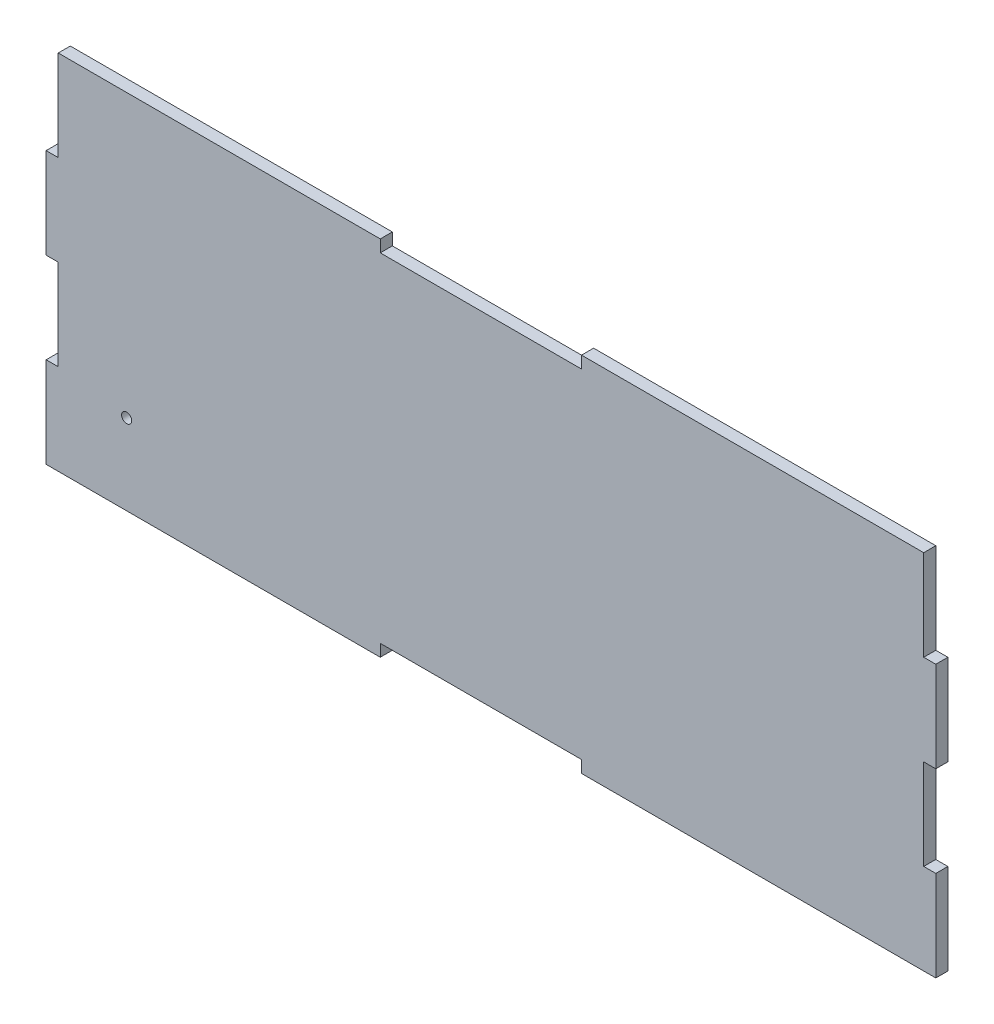
ISO-10303-21;
HEADER;
FILE_DESCRIPTION(('STEP AP214'),'2;1');
FILE_NAME('part.step','',(''),(''),'','','');
FILE_SCHEMA(('AUTOMOTIVE_DESIGN { 1 0 10303 214 1 1 1 1 }'));
ENDSEC;
DATA;
#1=APPLICATION_CONTEXT('core data for automotive mechanical design processes');
#2=APPLICATION_PROTOCOL_DEFINITION('international standard','automotive_design',2000,#1);
#3=PRODUCT_CONTEXT('',#1,'mechanical');
#4=PRODUCT('Part','Part','',(#3));
#5=PRODUCT_RELATED_PRODUCT_CATEGORY('part','',(#4));
#6=PRODUCT_DEFINITION_FORMATION('','',#4);
#7=PRODUCT_DEFINITION_CONTEXT('part definition',#1,'design');
#8=PRODUCT_DEFINITION('design','',#6,#7);
#9=PRODUCT_DEFINITION_SHAPE('','',#8);
#10=(LENGTH_UNIT() NAMED_UNIT(*) SI_UNIT(.MILLI.,.METRE.));
#11=(NAMED_UNIT(*) PLANE_ANGLE_UNIT() SI_UNIT($,.RADIAN.));
#12=(NAMED_UNIT(*) SI_UNIT($,.STERADIAN.) SOLID_ANGLE_UNIT());
#13=UNCERTAINTY_MEASURE_WITH_UNIT(LENGTH_MEASURE(1.E-05),#10,'distance_accuracy_value','');
#14=(GEOMETRIC_REPRESENTATION_CONTEXT(3) GLOBAL_UNCERTAINTY_ASSIGNED_CONTEXT((#13)) GLOBAL_UNIT_ASSIGNED_CONTEXT((#10,
#11,#12)) REPRESENTATION_CONTEXT('',''));
#15=CARTESIAN_POINT('',(0.,0.,0.));
#16=DIRECTION('',(0.,0.,1.));
#17=DIRECTION('',(1.,0.,0.));
#18=AXIS2_PLACEMENT_3D('',#15,#16,#17);
#19=CARTESIAN_POINT('',(0.,0.,3.));
#20=DIRECTION('',(0.,0.,-1.));
#21=DIRECTION('',(-1.,0.,0.));
#22=AXIS2_PLACEMENT_3D('',#19,#20,#21);
#23=PLANE('',#22);
#24=DIRECTION('',(1.,0.,0.));
#25=VECTOR('',#24,1.);
#26=CARTESIAN_POINT('',(-2.00000000000049,-43.,3.));
#27=LINE('',#26,#25);
#28=CARTESIAN_POINT('',(-5.00000000000049,-43.,3.));
#29=VERTEX_POINT('',#28);
#30=CARTESIAN_POINT('',(77.9999999999995,-43.,3.));
#31=VERTEX_POINT('',#30);
#32=EDGE_CURVE('E140',#29,#31,#27,.T.);
#33=ORIENTED_EDGE('',*,*,#32,.T.);
#34=DIRECTION('',(0.,1.,0.));
#35=VECTOR('',#34,1.);
#36=CARTESIAN_POINT('',(77.9999999999995,-43.,3.));
#37=LINE('',#36,#35);
#38=CARTESIAN_POINT('',(77.9999999999995,-40.,3.));
#39=VERTEX_POINT('',#38);
#40=EDGE_CURVE('E401',#31,#39,#37,.T.);
#41=ORIENTED_EDGE('',*,*,#40,.T.);
#42=DIRECTION('',(1.,0.,0.));
#43=VECTOR('',#42,1.);
#44=CARTESIAN_POINT('',(77.9999999999995,-40.,3.));
#45=LINE('',#44,#43);
#46=CARTESIAN_POINT('',(127.999999999999,-40.,3.));
#47=VERTEX_POINT('',#46);
#48=EDGE_CURVE('E337',#39,#47,#45,.T.);
#49=ORIENTED_EDGE('',*,*,#48,.T.);
#50=DIRECTION('',(0.,-1.,0.));
#51=VECTOR('',#50,1.);
#52=CARTESIAN_POINT('',(127.999999999999,-43.,3.));
#53=LINE('',#52,#51);
#54=CARTESIAN_POINT('',(127.999999999999,-43.,3.));
#55=VERTEX_POINT('',#54);
#56=EDGE_CURVE('E355',#47,#55,#53,.T.);
#57=ORIENTED_EDGE('',*,*,#56,.T.);
#58=DIRECTION('',(1.,0.,0.));
#59=VECTOR('',#58,1.);
#60=CARTESIAN_POINT('',(127.999999999999,-43.,3.));
#61=LINE('',#60,#59);
#62=CARTESIAN_POINT('',(215.999999999999,-43.,3.));
#63=VERTEX_POINT('',#62);
#64=EDGE_CURVE('E352',#55,#63,#61,.T.);
#65=ORIENTED_EDGE('',*,*,#64,.T.);
#66=DIRECTION('',(0.,1.,0.));
#67=VECTOR('',#66,1.);
#68=CARTESIAN_POINT('',(215.999999999999,-43.,3.));
#69=LINE('',#68,#67);
#70=CARTESIAN_POINT('',(215.999999999999,-20.5,3.));
#71=VERTEX_POINT('',#70);
#72=EDGE_CURVE('E354',#63,#71,#69,.T.);
#73=ORIENTED_EDGE('',*,*,#72,.T.);
#74=DIRECTION('',(-1.,0.,0.));
#75=VECTOR('',#74,1.);
#76=CARTESIAN_POINT('',(212.999999999999,-20.5,3.));
#77=LINE('',#76,#75);
#78=CARTESIAN_POINT('',(212.999999999999,-20.5,3.));
#79=VERTEX_POINT('',#78);
#80=EDGE_CURVE('E357',#71,#79,#77,.T.);
#81=ORIENTED_EDGE('',*,*,#80,.T.);
#82=DIRECTION('',(0.,1.,0.));
#83=VECTOR('',#82,1.);
#84=CARTESIAN_POINT('',(212.999999999999,-20.5,3.));
#85=LINE('',#84,#83);
#86=CARTESIAN_POINT('',(212.999999999999,2.,3.));
#87=VERTEX_POINT('',#86);
#88=EDGE_CURVE('E363',#79,#87,#85,.T.);
#89=ORIENTED_EDGE('',*,*,#88,.T.);
#90=DIRECTION('',(1.,0.,0.));
#91=VECTOR('',#90,1.);
#92=CARTESIAN_POINT('',(212.999999999999,2.,3.));
#93=LINE('',#92,#91);
#94=CARTESIAN_POINT('',(215.999999999999,2.,3.));
#95=VERTEX_POINT('',#94);
#96=EDGE_CURVE('E365',#87,#95,#93,.T.);
#97=ORIENTED_EDGE('',*,*,#96,.T.);
#98=DIRECTION('',(0.,1.,0.));
#99=VECTOR('',#98,1.);
#100=CARTESIAN_POINT('',(215.999999999999,24.5,3.));
#101=LINE('',#100,#99);
#102=CARTESIAN_POINT('',(215.999999999999,24.5,3.));
#103=VERTEX_POINT('',#102);
#104=EDGE_CURVE('E367',#95,#103,#101,.T.);
#105=ORIENTED_EDGE('',*,*,#104,.T.);
#106=DIRECTION('',(-1.,0.,0.));
#107=VECTOR('',#106,1.);
#108=CARTESIAN_POINT('',(212.999999999999,24.5,3.));
#109=LINE('',#108,#107);
#110=CARTESIAN_POINT('',(212.999999999999,24.5,3.));
#111=VERTEX_POINT('',#110);
#112=EDGE_CURVE('E369',#103,#111,#109,.T.);
#113=ORIENTED_EDGE('',*,*,#112,.T.);
#114=DIRECTION('',(0.,1.,0.));
#115=VECTOR('',#114,1.);
#116=CARTESIAN_POINT('',(212.999999999999,24.5,3.));
#117=LINE('',#116,#115);
#118=CARTESIAN_POINT('',(212.999999999999,47.,3.));
#119=VERTEX_POINT('',#118);
#120=EDGE_CURVE('E371',#111,#119,#117,.T.);
#121=ORIENTED_EDGE('',*,*,#120,.T.);
#122=DIRECTION('',(-1.,0.,0.));
#123=VECTOR('',#122,1.);
#124=CARTESIAN_POINT('',(128.,47.,3.));
#125=LINE('',#124,#123);
#126=CARTESIAN_POINT('',(128.,47.,3.));
#127=VERTEX_POINT('',#126);
#128=EDGE_CURVE('E373',#119,#127,#125,.T.);
#129=ORIENTED_EDGE('',*,*,#128,.T.);
#130=DIRECTION('',(0.,-1.,0.));
#131=VECTOR('',#130,1.);
#132=CARTESIAN_POINT('',(128.,47.,3.));
#133=LINE('',#132,#131);
#134=CARTESIAN_POINT('',(128.,44.,3.));
#135=VERTEX_POINT('',#134);
#136=EDGE_CURVE('E375',#127,#135,#133,.T.);
#137=ORIENTED_EDGE('',*,*,#136,.T.);
#138=DIRECTION('',(-1.,0.,0.));
#139=VECTOR('',#138,1.);
#140=CARTESIAN_POINT('',(77.9999999999995,44.,3.));
#141=LINE('',#140,#139);
#142=CARTESIAN_POINT('',(77.9999999999995,44.,3.));
#143=VERTEX_POINT('',#142);
#144=EDGE_CURVE('E377',#135,#143,#141,.T.);
#145=ORIENTED_EDGE('',*,*,#144,.T.);
#146=DIRECTION('',(0.,1.,0.));
#147=VECTOR('',#146,1.);
#148=CARTESIAN_POINT('',(77.9999999999995,47.,3.));
#149=LINE('',#148,#147);
#150=CARTESIAN_POINT('',(77.9999999999995,47.,3.));
#151=VERTEX_POINT('',#150);
#152=EDGE_CURVE('E379',#143,#151,#149,.T.);
#153=ORIENTED_EDGE('',*,*,#152,.T.);
#154=DIRECTION('',(-1.,0.,0.));
#155=VECTOR('',#154,1.);
#156=CARTESIAN_POINT('',(-2.00000000000051,47.,3.));
#157=LINE('',#156,#155);
#158=CARTESIAN_POINT('',(-2.00000000000051,47.,3.));
#159=VERTEX_POINT('',#158);
#160=EDGE_CURVE('E381',#151,#159,#157,.T.);
#161=ORIENTED_EDGE('',*,*,#160,.T.);
#162=DIRECTION('',(0.,-1.,0.));
#163=VECTOR('',#162,1.);
#164=CARTESIAN_POINT('',(-2.0000000000005,24.5,3.));
#165=LINE('',#164,#163);
#166=CARTESIAN_POINT('',(-2.0000000000005,24.5,3.));
#167=VERTEX_POINT('',#166);
#168=EDGE_CURVE('E383',#159,#167,#165,.T.);
#169=ORIENTED_EDGE('',*,*,#168,.T.);
#170=DIRECTION('',(-1.,0.,0.));
#171=VECTOR('',#170,1.);
#172=CARTESIAN_POINT('',(-2.0000000000005,24.5,3.));
#173=LINE('',#172,#171);
#174=CARTESIAN_POINT('',(-5.0000000000005,24.5,3.));
#175=VERTEX_POINT('',#174);
#176=EDGE_CURVE('E385',#167,#175,#173,.T.);
#177=ORIENTED_EDGE('',*,*,#176,.T.);
#178=DIRECTION('',(0.,-1.,0.));
#179=VECTOR('',#178,1.);
#180=CARTESIAN_POINT('',(-5.0000000000005,24.5,3.));
#181=LINE('',#180,#179);
#182=CARTESIAN_POINT('',(-5.0000000000005,2.,3.));
#183=VERTEX_POINT('',#182);
#184=EDGE_CURVE('E387',#175,#183,#181,.T.);
#185=ORIENTED_EDGE('',*,*,#184,.T.);
#186=DIRECTION('',(1.,0.,0.));
#187=VECTOR('',#186,1.);
#188=CARTESIAN_POINT('',(-2.00000000000049,2.,3.));
#189=LINE('',#188,#187);
#190=CARTESIAN_POINT('',(-2.00000000000049,2.,3.));
#191=VERTEX_POINT('',#190);
#192=EDGE_CURVE('E208',#183,#191,#189,.T.);
#193=ORIENTED_EDGE('',*,*,#192,.T.);
#194=DIRECTION('',(0.,-1.,0.));
#195=VECTOR('',#194,1.);
#196=CARTESIAN_POINT('',(-2.00000000000049,-20.5,3.));
#197=LINE('',#196,#195);
#198=CARTESIAN_POINT('',(-2.00000000000049,-20.5,3.));
#199=VERTEX_POINT('',#198);
#200=EDGE_CURVE('E202',#191,#199,#197,.T.);
#201=ORIENTED_EDGE('',*,*,#200,.T.);
#202=DIRECTION('',(-1.,0.,0.));
#203=VECTOR('',#202,1.);
#204=CARTESIAN_POINT('',(-2.00000000000049,-20.5,3.));
#205=LINE('',#204,#203);
#206=CARTESIAN_POINT('',(-5.00000000000049,-20.5,3.));
#207=VERTEX_POINT('',#206);
#208=EDGE_CURVE('E206',#199,#207,#205,.T.);
#209=ORIENTED_EDGE('',*,*,#208,.T.);
#210=DIRECTION('',(0.,-1.,0.));
#211=VECTOR('',#210,1.);
#212=CARTESIAN_POINT('',(-5.00000000000049,-43.,3.));
#213=LINE('',#212,#211);
#214=EDGE_CURVE('E50',#207,#29,#213,.T.);
#215=ORIENTED_EDGE('',*,*,#214,.T.);
#216=EDGE_LOOP('',(#33,#41,#49,#57,#65,#73,#81,#89,#97,#105,#113,#121,#129,#137,#145,#153,#161,
#169,#177,#185,#193,#201,#209,#215));
#217=FACE_BOUND('',#216,.T.);
#218=CARTESIAN_POINT('',(14.9999999999995,-23.,3.));
#219=DIRECTION('',(0.,0.,1.));
#220=DIRECTION('',(1.,0.,0.));
#221=AXIS2_PLACEMENT_3D('',#218,#219,#220);
#222=CIRCLE('',#221,1.25000000000001);
#223=CARTESIAN_POINT('',(16.2499999999995,-23.,3.));
#224=VERTEX_POINT('',#223);
#225=EDGE_CURVE('E228',#224,#224,#222,.T.);
#226=ORIENTED_EDGE('',*,*,#225,.F.);
#227=EDGE_LOOP('',(#226));
#228=FACE_BOUND('',#227,.T.);
#229=ADVANCED_FACE('F33',(#217,#228),#23,.F.);
#230=CARTESIAN_POINT('',(0.,0.,0.));
#231=DIRECTION('',(0.,0.,-1.));
#232=DIRECTION('',(-1.,0.,0.));
#233=AXIS2_PLACEMENT_3D('',#230,#231,#232);
#234=PLANE('',#233);
#235=DIRECTION('',(1.,0.,0.));
#236=VECTOR('',#235,1.);
#237=CARTESIAN_POINT('',(-2.00000000000049,-43.,0.));
#238=LINE('',#237,#236);
#239=CARTESIAN_POINT('',(-5.00000000000049,-43.,0.));
#240=VERTEX_POINT('',#239);
#241=CARTESIAN_POINT('',(77.9999999999995,-43.,0.));
#242=VERTEX_POINT('',#241);
#243=EDGE_CURVE('E134',#240,#242,#238,.T.);
#244=ORIENTED_EDGE('',*,*,#243,.F.);
#245=DIRECTION('',(0.,-1.,0.));
#246=VECTOR('',#245,1.);
#247=CARTESIAN_POINT('',(-5.00000000000049,-43.,0.));
#248=LINE('',#247,#246);
#249=CARTESIAN_POINT('',(-5.00000000000049,-20.5,0.));
#250=VERTEX_POINT('',#249);
#251=EDGE_CURVE('E271',#250,#240,#248,.T.);
#252=ORIENTED_EDGE('',*,*,#251,.F.);
#253=DIRECTION('',(-1.,0.,0.));
#254=VECTOR('',#253,1.);
#255=CARTESIAN_POINT('',(-2.00000000000049,-20.5,0.));
#256=LINE('',#255,#254);
#257=CARTESIAN_POINT('',(-2.00000000000049,-20.5,0.));
#258=VERTEX_POINT('',#257);
#259=EDGE_CURVE('E127',#258,#250,#256,.T.);
#260=ORIENTED_EDGE('',*,*,#259,.F.);
#261=DIRECTION('',(0.,-1.,0.));
#262=VECTOR('',#261,1.);
#263=CARTESIAN_POINT('',(-2.00000000000049,-20.5,0.));
#264=LINE('',#263,#262);
#265=CARTESIAN_POINT('',(-2.00000000000049,2.,0.));
#266=VERTEX_POINT('',#265);
#267=EDGE_CURVE('E216',#266,#258,#264,.T.);
#268=ORIENTED_EDGE('',*,*,#267,.F.);
#269=DIRECTION('',(1.,0.,0.));
#270=VECTOR('',#269,1.);
#271=CARTESIAN_POINT('',(-2.00000000000049,2.,0.));
#272=LINE('',#271,#270);
#273=CARTESIAN_POINT('',(-5.0000000000005,2.,0.));
#274=VERTEX_POINT('',#273);
#275=EDGE_CURVE('E267',#274,#266,#272,.T.);
#276=ORIENTED_EDGE('',*,*,#275,.F.);
#277=DIRECTION('',(0.,-1.,0.));
#278=VECTOR('',#277,1.);
#279=CARTESIAN_POINT('',(-5.0000000000005,24.5,0.));
#280=LINE('',#279,#278);
#281=CARTESIAN_POINT('',(-5.0000000000005,24.5,0.));
#282=VERTEX_POINT('',#281);
#283=EDGE_CURVE('E265',#282,#274,#280,.T.);
#284=ORIENTED_EDGE('',*,*,#283,.F.);
#285=DIRECTION('',(-1.,0.,0.));
#286=VECTOR('',#285,1.);
#287=CARTESIAN_POINT('',(-2.0000000000005,24.5,0.));
#288=LINE('',#287,#286);
#289=CARTESIAN_POINT('',(-2.0000000000005,24.5,0.));
#290=VERTEX_POINT('',#289);
#291=EDGE_CURVE('E263',#290,#282,#288,.T.);
#292=ORIENTED_EDGE('',*,*,#291,.F.);
#293=DIRECTION('',(0.,-1.,0.));
#294=VECTOR('',#293,1.);
#295=CARTESIAN_POINT('',(-2.0000000000005,24.5,0.));
#296=LINE('',#295,#294);
#297=CARTESIAN_POINT('',(-2.00000000000051,47.,0.));
#298=VERTEX_POINT('',#297);
#299=EDGE_CURVE('E261',#298,#290,#296,.T.);
#300=ORIENTED_EDGE('',*,*,#299,.F.);
#301=DIRECTION('',(-1.,0.,0.));
#302=VECTOR('',#301,1.);
#303=CARTESIAN_POINT('',(-2.00000000000051,47.,0.));
#304=LINE('',#303,#302);
#305=CARTESIAN_POINT('',(77.9999999999995,47.,0.));
#306=VERTEX_POINT('',#305);
#307=EDGE_CURVE('E259',#306,#298,#304,.T.);
#308=ORIENTED_EDGE('',*,*,#307,.F.);
#309=DIRECTION('',(0.,1.,0.));
#310=VECTOR('',#309,1.);
#311=CARTESIAN_POINT('',(77.9999999999995,47.,0.));
#312=LINE('',#311,#310);
#313=CARTESIAN_POINT('',(77.9999999999995,44.,0.));
#314=VERTEX_POINT('',#313);
#315=EDGE_CURVE('E257',#314,#306,#312,.T.);
#316=ORIENTED_EDGE('',*,*,#315,.F.);
#317=DIRECTION('',(-1.,0.,0.));
#318=VECTOR('',#317,1.);
#319=CARTESIAN_POINT('',(77.9999999999995,44.,0.));
#320=LINE('',#319,#318);
#321=CARTESIAN_POINT('',(128.,44.,0.));
#322=VERTEX_POINT('',#321);
#323=EDGE_CURVE('E255',#322,#314,#320,.T.);
#324=ORIENTED_EDGE('',*,*,#323,.F.);
#325=DIRECTION('',(0.,-1.,0.));
#326=VECTOR('',#325,1.);
#327=CARTESIAN_POINT('',(128.,47.,0.));
#328=LINE('',#327,#326);
#329=CARTESIAN_POINT('',(128.,47.,0.));
#330=VERTEX_POINT('',#329);
#331=EDGE_CURVE('E253',#330,#322,#328,.T.);
#332=ORIENTED_EDGE('',*,*,#331,.F.);
#333=DIRECTION('',(-1.,0.,0.));
#334=VECTOR('',#333,1.);
#335=CARTESIAN_POINT('',(128.,47.,0.));
#336=LINE('',#335,#334);
#337=CARTESIAN_POINT('',(212.999999999999,47.,0.));
#338=VERTEX_POINT('',#337);
#339=EDGE_CURVE('E251',#338,#330,#336,.T.);
#340=ORIENTED_EDGE('',*,*,#339,.F.);
#341=DIRECTION('',(0.,1.,0.));
#342=VECTOR('',#341,1.);
#343=CARTESIAN_POINT('',(212.999999999999,24.5,0.));
#344=LINE('',#343,#342);
#345=CARTESIAN_POINT('',(212.999999999999,24.5,0.));
#346=VERTEX_POINT('',#345);
#347=EDGE_CURVE('E249',#346,#338,#344,.T.);
#348=ORIENTED_EDGE('',*,*,#347,.F.);
#349=DIRECTION('',(-1.,0.,0.));
#350=VECTOR('',#349,1.);
#351=CARTESIAN_POINT('',(212.999999999999,24.5,0.));
#352=LINE('',#351,#350);
#353=CARTESIAN_POINT('',(215.999999999999,24.5,0.));
#354=VERTEX_POINT('',#353);
#355=EDGE_CURVE('E247',#354,#346,#352,.T.);
#356=ORIENTED_EDGE('',*,*,#355,.F.);
#357=DIRECTION('',(0.,1.,0.));
#358=VECTOR('',#357,1.);
#359=CARTESIAN_POINT('',(215.999999999999,24.5,0.));
#360=LINE('',#359,#358);
#361=CARTESIAN_POINT('',(215.999999999999,2.,0.));
#362=VERTEX_POINT('',#361);
#363=EDGE_CURVE('E245',#362,#354,#360,.T.);
#364=ORIENTED_EDGE('',*,*,#363,.F.);
#365=DIRECTION('',(1.,0.,0.));
#366=VECTOR('',#365,1.);
#367=CARTESIAN_POINT('',(212.999999999999,2.,0.));
#368=LINE('',#367,#366);
#369=CARTESIAN_POINT('',(212.999999999999,2.,0.));
#370=VERTEX_POINT('',#369);
#371=EDGE_CURVE('E243',#370,#362,#368,.T.);
#372=ORIENTED_EDGE('',*,*,#371,.F.);
#373=DIRECTION('',(0.,1.,0.));
#374=VECTOR('',#373,1.);
#375=CARTESIAN_POINT('',(212.999999999999,-20.5,0.));
#376=LINE('',#375,#374);
#377=CARTESIAN_POINT('',(212.999999999999,-20.5,0.));
#378=VERTEX_POINT('',#377);
#379=EDGE_CURVE('E241',#378,#370,#376,.T.);
#380=ORIENTED_EDGE('',*,*,#379,.F.);
#381=DIRECTION('',(-1.,0.,0.));
#382=VECTOR('',#381,1.);
#383=CARTESIAN_POINT('',(212.999999999999,-20.5,0.));
#384=LINE('',#383,#382);
#385=CARTESIAN_POINT('',(215.999999999999,-20.5,0.));
#386=VERTEX_POINT('',#385);
#387=EDGE_CURVE('E239',#386,#378,#384,.T.);
#388=ORIENTED_EDGE('',*,*,#387,.F.);
#389=DIRECTION('',(0.,1.,0.));
#390=VECTOR('',#389,1.);
#391=CARTESIAN_POINT('',(215.999999999999,-43.,0.));
#392=LINE('',#391,#390);
#393=CARTESIAN_POINT('',(215.999999999999,-43.,0.));
#394=VERTEX_POINT('',#393);
#395=EDGE_CURVE('E237',#394,#386,#392,.T.);
#396=ORIENTED_EDGE('',*,*,#395,.F.);
#397=DIRECTION('',(1.,0.,0.));
#398=VECTOR('',#397,1.);
#399=CARTESIAN_POINT('',(212.999999999999,-43.,0.));
#400=LINE('',#399,#398);
#401=CARTESIAN_POINT('',(127.999999999999,-43.,0.));
#402=VERTEX_POINT('',#401);
#403=EDGE_CURVE('E235',#402,#394,#400,.T.);
#404=ORIENTED_EDGE('',*,*,#403,.F.);
#405=DIRECTION('',(0.,-1.,0.));
#406=VECTOR('',#405,1.);
#407=CARTESIAN_POINT('',(127.999999999999,-43.,0.));
#408=LINE('',#407,#406);
#409=CARTESIAN_POINT('',(127.999999999999,-40.,0.));
#410=VERTEX_POINT('',#409);
#411=EDGE_CURVE('E232',#410,#402,#408,.T.);
#412=ORIENTED_EDGE('',*,*,#411,.F.);
#413=DIRECTION('',(1.,0.,0.));
#414=VECTOR('',#413,1.);
#415=CARTESIAN_POINT('',(77.9999999999995,-40.,0.));
#416=LINE('',#415,#414);
#417=CARTESIAN_POINT('',(77.9999999999995,-40.,0.));
#418=VERTEX_POINT('',#417);
#419=EDGE_CURVE('E230',#418,#410,#416,.T.);
#420=ORIENTED_EDGE('',*,*,#419,.F.);
#421=DIRECTION('',(0.,1.,0.));
#422=VECTOR('',#421,1.);
#423=CARTESIAN_POINT('',(77.9999999999995,-43.,0.));
#424=LINE('',#423,#422);
#425=EDGE_CURVE('E227',#242,#418,#424,.T.);
#426=ORIENTED_EDGE('',*,*,#425,.F.);
#427=EDGE_LOOP('',(#244,#252,#260,#268,#276,#284,#292,#300,#308,#316,#324,#332,#340,#348,#356,
#364,#372,#380,#388,#396,#404,#412,#420,#426));
#428=FACE_BOUND('',#427,.T.);
#429=CARTESIAN_POINT('',(14.9999999999995,-23.,0.));
#430=DIRECTION('',(0.,0.,1.));
#431=DIRECTION('',(1.,0.,0.));
#432=AXIS2_PLACEMENT_3D('',#429,#430,#431);
#433=CIRCLE('',#432,1.25000000000001);
#434=CARTESIAN_POINT('',(16.2499999999995,-23.,0.));
#435=VERTEX_POINT('',#434);
#436=EDGE_CURVE('E405',#435,#435,#433,.T.);
#437=ORIENTED_EDGE('',*,*,#436,.T.);
#438=EDGE_LOOP('',(#437));
#439=FACE_BOUND('',#438,.T.);
#440=ADVANCED_FACE('F341',(#428,#439),#234,.T.);
#441=CARTESIAN_POINT('',(-2.00000000000049,-43.,3.));
#442=DIRECTION('',(0.,1.,0.));
#443=DIRECTION('',(0.,0.,1.));
#444=AXIS2_PLACEMENT_3D('',#441,#442,#443);
#445=PLANE('',#444);
#446=ORIENTED_EDGE('',*,*,#243,.T.);
#447=DIRECTION('',(0.,0.,-1.));
#448=VECTOR('',#447,1.);
#449=CARTESIAN_POINT('',(77.9999999999995,-43.,3.));
#450=LINE('',#449,#448);
#451=EDGE_CURVE('E11',#31,#242,#450,.T.);
#452=ORIENTED_EDGE('',*,*,#451,.F.);
#453=ORIENTED_EDGE('',*,*,#32,.F.);
#454=DIRECTION('',(0.,0.,-1.));
#455=VECTOR('',#454,1.);
#456=CARTESIAN_POINT('',(-5.00000000000049,-43.,3.));
#457=LINE('',#456,#455);
#458=EDGE_CURVE('E222',#29,#240,#457,.T.);
#459=ORIENTED_EDGE('',*,*,#458,.T.);
#460=EDGE_LOOP('',(#446,#452,#453,#459));
#461=FACE_BOUND('',#460,.T.);
#462=ADVANCED_FACE('F35',(#461),#445,.F.);
#463=CARTESIAN_POINT('',(77.9999999999995,-43.,3.));
#464=DIRECTION('',(-1.,0.,0.));
#465=DIRECTION('',(0.,0.,1.));
#466=AXIS2_PLACEMENT_3D('',#463,#464,#465);
#467=PLANE('',#466);
#468=ORIENTED_EDGE('',*,*,#425,.T.);
#469=DIRECTION('',(0.,0.,-1.));
#470=VECTOR('',#469,1.);
#471=CARTESIAN_POINT('',(77.9999999999995,-40.,3.));
#472=LINE('',#471,#470);
#473=EDGE_CURVE('E42',#39,#418,#472,.T.);
#474=ORIENTED_EDGE('',*,*,#473,.F.);
#475=ORIENTED_EDGE('',*,*,#40,.F.);
#476=ORIENTED_EDGE('',*,*,#451,.T.);
#477=EDGE_LOOP('',(#468,#474,#475,#476));
#478=FACE_BOUND('',#477,.T.);
#479=ADVANCED_FACE('F407',(#478),#467,.F.);
#480=CARTESIAN_POINT('',(77.9999999999995,-40.,3.));
#481=DIRECTION('',(0.,1.,0.));
#482=DIRECTION('',(0.,0.,1.));
#483=AXIS2_PLACEMENT_3D('',#480,#481,#482);
#484=PLANE('',#483);
#485=ORIENTED_EDGE('',*,*,#419,.T.);
#486=DIRECTION('',(0.,0.,-1.));
#487=VECTOR('',#486,1.);
#488=CARTESIAN_POINT('',(127.999999999999,-40.,3.));
#489=LINE('',#488,#487);
#490=EDGE_CURVE('E328',#47,#410,#489,.T.);
#491=ORIENTED_EDGE('',*,*,#490,.F.);
#492=ORIENTED_EDGE('',*,*,#48,.F.);
#493=ORIENTED_EDGE('',*,*,#473,.T.);
#494=EDGE_LOOP('',(#485,#491,#492,#493));
#495=FACE_BOUND('',#494,.T.);
#496=ADVANCED_FACE('F335',(#495),#484,.F.);
#497=CARTESIAN_POINT('',(127.999999999999,-43.,3.));
#498=DIRECTION('',(1.,0.,0.));
#499=DIRECTION('',(0.,0.,-1.));
#500=AXIS2_PLACEMENT_3D('',#497,#498,#499);
#501=PLANE('',#500);
#502=ORIENTED_EDGE('',*,*,#411,.T.);
#503=DIRECTION('',(0.,0.,-1.));
#504=VECTOR('',#503,1.);
#505=CARTESIAN_POINT('',(127.999999999999,-43.,3.));
#506=LINE('',#505,#504);
#507=EDGE_CURVE('E325',#55,#402,#506,.T.);
#508=ORIENTED_EDGE('',*,*,#507,.F.);
#509=ORIENTED_EDGE('',*,*,#56,.F.);
#510=ORIENTED_EDGE('',*,*,#490,.T.);
#511=EDGE_LOOP('',(#502,#508,#509,#510));
#512=FACE_BOUND('',#511,.T.);
#513=ADVANCED_FACE('F346',(#512),#501,.F.);
#514=CARTESIAN_POINT('',(212.999999999999,-43.,3.));
#515=DIRECTION('',(0.,1.,0.));
#516=DIRECTION('',(0.,0.,1.));
#517=AXIS2_PLACEMENT_3D('',#514,#515,#516);
#518=PLANE('',#517);
#519=ORIENTED_EDGE('',*,*,#403,.T.);
#520=DIRECTION('',(0.,0.,-1.));
#521=VECTOR('',#520,1.);
#522=CARTESIAN_POINT('',(215.999999999999,-43.,3.));
#523=LINE('',#522,#521);
#524=EDGE_CURVE('E322',#63,#394,#523,.T.);
#525=ORIENTED_EDGE('',*,*,#524,.F.);
#526=ORIENTED_EDGE('',*,*,#64,.F.);
#527=ORIENTED_EDGE('',*,*,#507,.T.);
#528=EDGE_LOOP('',(#519,#525,#526,#527));
#529=FACE_BOUND('',#528,.T.);
#530=ADVANCED_FACE('F350',(#529),#518,.F.);
#531=CARTESIAN_POINT('',(215.999999999999,-43.,3.));
#532=DIRECTION('',(-1.,0.,0.));
#533=DIRECTION('',(0.,-1.,0.));
#534=AXIS2_PLACEMENT_3D('',#531,#532,#533);
#535=PLANE('',#534);
#536=ORIENTED_EDGE('',*,*,#395,.T.);
#537=DIRECTION('',(0.,0.,-1.));
#538=VECTOR('',#537,1.);
#539=CARTESIAN_POINT('',(215.999999999999,-20.5,3.));
#540=LINE('',#539,#538);
#541=EDGE_CURVE('E319',#71,#386,#540,.T.);
#542=ORIENTED_EDGE('',*,*,#541,.F.);
#543=ORIENTED_EDGE('',*,*,#72,.F.);
#544=ORIENTED_EDGE('',*,*,#524,.T.);
#545=EDGE_LOOP('',(#536,#542,#543,#544));
#546=FACE_BOUND('',#545,.T.);
#547=ADVANCED_FACE('F484',(#546),#535,.F.);
#548=CARTESIAN_POINT('',(212.999999999999,-20.5,3.));
#549=DIRECTION('',(0.,-1.,0.));
#550=DIRECTION('',(1.,0.,0.));
#551=AXIS2_PLACEMENT_3D('',#548,#549,#550);
#552=PLANE('',#551);
#553=ORIENTED_EDGE('',*,*,#387,.T.);
#554=DIRECTION('',(0.,0.,-1.));
#555=VECTOR('',#554,1.);
#556=CARTESIAN_POINT('',(212.999999999999,-20.5,3.));
#557=LINE('',#556,#555);
#558=EDGE_CURVE('E316',#79,#378,#557,.T.);
#559=ORIENTED_EDGE('',*,*,#558,.F.);
#560=ORIENTED_EDGE('',*,*,#80,.F.);
#561=ORIENTED_EDGE('',*,*,#541,.T.);
#562=EDGE_LOOP('',(#553,#559,#560,#561));
#563=FACE_BOUND('',#562,.T.);
#564=ADVANCED_FACE('F480',(#563),#552,.F.);
#565=CARTESIAN_POINT('',(212.999999999999,-20.5,3.));
#566=DIRECTION('',(-1.,0.,0.));
#567=DIRECTION('',(0.,0.,1.));
#568=AXIS2_PLACEMENT_3D('',#565,#566,#567);
#569=PLANE('',#568);
#570=ORIENTED_EDGE('',*,*,#379,.T.);
#571=DIRECTION('',(0.,0.,-1.));
#572=VECTOR('',#571,1.);
#573=CARTESIAN_POINT('',(212.999999999999,2.,3.));
#574=LINE('',#573,#572);
#575=EDGE_CURVE('E313',#87,#370,#574,.T.);
#576=ORIENTED_EDGE('',*,*,#575,.F.);
#577=ORIENTED_EDGE('',*,*,#88,.F.);
#578=ORIENTED_EDGE('',*,*,#558,.T.);
#579=EDGE_LOOP('',(#570,#576,#577,#578));
#580=FACE_BOUND('',#579,.T.);
#581=ADVANCED_FACE('F476',(#580),#569,.F.);
#582=CARTESIAN_POINT('',(212.999999999999,2.,3.));
#583=DIRECTION('',(0.,1.,0.));
#584=DIRECTION('',(0.,0.,1.));
#585=AXIS2_PLACEMENT_3D('',#582,#583,#584);
#586=PLANE('',#585);
#587=ORIENTED_EDGE('',*,*,#371,.T.);
#588=DIRECTION('',(0.,0.,-1.));
#589=VECTOR('',#588,1.);
#590=CARTESIAN_POINT('',(215.999999999999,2.,3.));
#591=LINE('',#590,#589);
#592=EDGE_CURVE('E310',#95,#362,#591,.T.);
#593=ORIENTED_EDGE('',*,*,#592,.F.);
#594=ORIENTED_EDGE('',*,*,#96,.F.);
#595=ORIENTED_EDGE('',*,*,#575,.T.);
#596=EDGE_LOOP('',(#587,#593,#594,#595));
#597=FACE_BOUND('',#596,.T.);
#598=ADVANCED_FACE('F472',(#597),#586,.F.);
#599=CARTESIAN_POINT('',(215.999999999999,24.5,3.));
#600=DIRECTION('',(-1.,0.,0.));
#601=DIRECTION('',(0.,0.,1.));
#602=AXIS2_PLACEMENT_3D('',#599,#600,#601);
#603=PLANE('',#602);
#604=ORIENTED_EDGE('',*,*,#363,.T.);
#605=DIRECTION('',(0.,0.,-1.));
#606=VECTOR('',#605,1.);
#607=CARTESIAN_POINT('',(215.999999999999,24.5,3.));
#608=LINE('',#607,#606);
#609=EDGE_CURVE('E307',#103,#354,#608,.T.);
#610=ORIENTED_EDGE('',*,*,#609,.F.);
#611=ORIENTED_EDGE('',*,*,#104,.F.);
#612=ORIENTED_EDGE('',*,*,#592,.T.);
#613=EDGE_LOOP('',(#604,#610,#611,#612));
#614=FACE_BOUND('',#613,.T.);
#615=ADVANCED_FACE('F468',(#614),#603,.F.);
#616=CARTESIAN_POINT('',(212.999999999999,24.5,3.));
#617=DIRECTION('',(0.,-1.,0.));
#618=DIRECTION('',(0.,0.,-1.));
#619=AXIS2_PLACEMENT_3D('',#616,#617,#618);
#620=PLANE('',#619);
#621=ORIENTED_EDGE('',*,*,#355,.T.);
#622=DIRECTION('',(0.,0.,-1.));
#623=VECTOR('',#622,1.);
#624=CARTESIAN_POINT('',(212.999999999999,24.5,3.));
#625=LINE('',#624,#623);
#626=EDGE_CURVE('E304',#111,#346,#625,.T.);
#627=ORIENTED_EDGE('',*,*,#626,.F.);
#628=ORIENTED_EDGE('',*,*,#112,.F.);
#629=ORIENTED_EDGE('',*,*,#609,.T.);
#630=EDGE_LOOP('',(#621,#627,#628,#629));
#631=FACE_BOUND('',#630,.T.);
#632=ADVANCED_FACE('F464',(#631),#620,.F.);
#633=CARTESIAN_POINT('',(212.999999999999,24.5,3.));
#634=DIRECTION('',(-1.,0.,0.));
#635=DIRECTION('',(0.,0.,1.));
#636=AXIS2_PLACEMENT_3D('',#633,#634,#635);
#637=PLANE('',#636);
#638=ORIENTED_EDGE('',*,*,#347,.T.);
#639=DIRECTION('',(0.,0.,-1.));
#640=VECTOR('',#639,1.);
#641=CARTESIAN_POINT('',(212.999999999999,47.,3.));
#642=LINE('',#641,#640);
#643=EDGE_CURVE('E301',#119,#338,#642,.T.);
#644=ORIENTED_EDGE('',*,*,#643,.F.);
#645=ORIENTED_EDGE('',*,*,#120,.F.);
#646=ORIENTED_EDGE('',*,*,#626,.T.);
#647=EDGE_LOOP('',(#638,#644,#645,#646));
#648=FACE_BOUND('',#647,.T.);
#649=ADVANCED_FACE('F460',(#648),#637,.F.);
#650=CARTESIAN_POINT('',(128.,47.,3.));
#651=DIRECTION('',(0.,-1.,0.));
#652=DIRECTION('',(1.,0.,0.));
#653=AXIS2_PLACEMENT_3D('',#650,#651,#652);
#654=PLANE('',#653);
#655=ORIENTED_EDGE('',*,*,#339,.T.);
#656=DIRECTION('',(0.,0.,-1.));
#657=VECTOR('',#656,1.);
#658=CARTESIAN_POINT('',(128.,47.,3.));
#659=LINE('',#658,#657);
#660=EDGE_CURVE('E298',#127,#330,#659,.T.);
#661=ORIENTED_EDGE('',*,*,#660,.F.);
#662=ORIENTED_EDGE('',*,*,#128,.F.);
#663=ORIENTED_EDGE('',*,*,#643,.T.);
#664=EDGE_LOOP('',(#655,#661,#662,#663));
#665=FACE_BOUND('',#664,.T.);
#666=ADVANCED_FACE('F456',(#665),#654,.F.);
#667=CARTESIAN_POINT('',(128.,47.,3.));
#668=DIRECTION('',(1.,0.,0.));
#669=DIRECTION('',(0.,1.,0.));
#670=AXIS2_PLACEMENT_3D('',#667,#668,#669);
#671=PLANE('',#670);
#672=ORIENTED_EDGE('',*,*,#331,.T.);
#673=DIRECTION('',(0.,0.,-1.));
#674=VECTOR('',#673,1.);
#675=CARTESIAN_POINT('',(128.,44.,3.));
#676=LINE('',#675,#674);
#677=EDGE_CURVE('E295',#135,#322,#676,.T.);
#678=ORIENTED_EDGE('',*,*,#677,.F.);
#679=ORIENTED_EDGE('',*,*,#136,.F.);
#680=ORIENTED_EDGE('',*,*,#660,.T.);
#681=EDGE_LOOP('',(#672,#678,#679,#680));
#682=FACE_BOUND('',#681,.T.);
#683=ADVANCED_FACE('F452',(#682),#671,.F.);
#684=CARTESIAN_POINT('',(77.9999999999995,44.,3.));
#685=DIRECTION('',(0.,-1.,0.));
#686=DIRECTION('',(1.,0.,0.));
#687=AXIS2_PLACEMENT_3D('',#684,#685,#686);
#688=PLANE('',#687);
#689=ORIENTED_EDGE('',*,*,#323,.T.);
#690=DIRECTION('',(0.,0.,-1.));
#691=VECTOR('',#690,1.);
#692=CARTESIAN_POINT('',(77.9999999999995,44.,3.));
#693=LINE('',#692,#691);
#694=EDGE_CURVE('E292',#143,#314,#693,.T.);
#695=ORIENTED_EDGE('',*,*,#694,.F.);
#696=ORIENTED_EDGE('',*,*,#144,.F.);
#697=ORIENTED_EDGE('',*,*,#677,.T.);
#698=EDGE_LOOP('',(#689,#695,#696,#697));
#699=FACE_BOUND('',#698,.T.);
#700=ADVANCED_FACE('F448',(#699),#688,.F.);
#701=CARTESIAN_POINT('',(77.9999999999995,47.,3.));
#702=DIRECTION('',(-1.,0.,0.));
#703=DIRECTION('',(0.,-1.,0.));
#704=AXIS2_PLACEMENT_3D('',#701,#702,#703);
#705=PLANE('',#704);
#706=ORIENTED_EDGE('',*,*,#315,.T.);
#707=DIRECTION('',(0.,0.,-1.));
#708=VECTOR('',#707,1.);
#709=CARTESIAN_POINT('',(77.9999999999995,47.,3.));
#710=LINE('',#709,#708);
#711=EDGE_CURVE('E289',#151,#306,#710,.T.);
#712=ORIENTED_EDGE('',*,*,#711,.F.);
#713=ORIENTED_EDGE('',*,*,#152,.F.);
#714=ORIENTED_EDGE('',*,*,#694,.T.);
#715=EDGE_LOOP('',(#706,#712,#713,#714));
#716=FACE_BOUND('',#715,.T.);
#717=ADVANCED_FACE('F444',(#716),#705,.F.);
#718=CARTESIAN_POINT('',(-2.00000000000051,47.,3.));
#719=DIRECTION('',(0.,-1.,0.));
#720=DIRECTION('',(0.,0.,-1.));
#721=AXIS2_PLACEMENT_3D('',#718,#719,#720);
#722=PLANE('',#721);
#723=ORIENTED_EDGE('',*,*,#307,.T.);
#724=DIRECTION('',(0.,0.,-1.));
#725=VECTOR('',#724,1.);
#726=CARTESIAN_POINT('',(-2.00000000000051,47.,3.));
#727=LINE('',#726,#725);
#728=EDGE_CURVE('E286',#159,#298,#727,.T.);
#729=ORIENTED_EDGE('',*,*,#728,.F.);
#730=ORIENTED_EDGE('',*,*,#160,.F.);
#731=ORIENTED_EDGE('',*,*,#711,.T.);
#732=EDGE_LOOP('',(#723,#729,#730,#731));
#733=FACE_BOUND('',#732,.T.);
#734=ADVANCED_FACE('F440',(#733),#722,.F.);
#735=CARTESIAN_POINT('',(-2.0000000000005,24.5,3.));
#736=DIRECTION('',(1.,0.,0.));
#737=DIRECTION('',(0.,1.,0.));
#738=AXIS2_PLACEMENT_3D('',#735,#736,#737);
#739=PLANE('',#738);
#740=ORIENTED_EDGE('',*,*,#299,.T.);
#741=DIRECTION('',(0.,0.,-1.));
#742=VECTOR('',#741,1.);
#743=CARTESIAN_POINT('',(-2.0000000000005,24.5,3.));
#744=LINE('',#743,#742);
#745=EDGE_CURVE('E283',#167,#290,#744,.T.);
#746=ORIENTED_EDGE('',*,*,#745,.F.);
#747=ORIENTED_EDGE('',*,*,#168,.F.);
#748=ORIENTED_EDGE('',*,*,#728,.T.);
#749=EDGE_LOOP('',(#740,#746,#747,#748));
#750=FACE_BOUND('',#749,.T.);
#751=ADVANCED_FACE('F436',(#750),#739,.F.);
#752=CARTESIAN_POINT('',(-2.0000000000005,24.5,3.));
#753=DIRECTION('',(0.,-1.,0.));
#754=DIRECTION('',(0.,0.,-1.));
#755=AXIS2_PLACEMENT_3D('',#752,#753,#754);
#756=PLANE('',#755);
#757=ORIENTED_EDGE('',*,*,#291,.T.);
#758=DIRECTION('',(0.,0.,-1.));
#759=VECTOR('',#758,1.);
#760=CARTESIAN_POINT('',(-5.0000000000005,24.5,3.));
#761=LINE('',#760,#759);
#762=EDGE_CURVE('E280',#175,#282,#761,.T.);
#763=ORIENTED_EDGE('',*,*,#762,.F.);
#764=ORIENTED_EDGE('',*,*,#176,.F.);
#765=ORIENTED_EDGE('',*,*,#745,.T.);
#766=EDGE_LOOP('',(#757,#763,#764,#765));
#767=FACE_BOUND('',#766,.T.);
#768=ADVANCED_FACE('F433',(#767),#756,.F.);
#769=CARTESIAN_POINT('',(-5.0000000000005,24.5,3.));
#770=DIRECTION('',(1.,0.,0.));
#771=DIRECTION('',(0.,1.,0.));
#772=AXIS2_PLACEMENT_3D('',#769,#770,#771);
#773=PLANE('',#772);
#774=ORIENTED_EDGE('',*,*,#283,.T.);
#775=DIRECTION('',(0.,0.,-1.));
#776=VECTOR('',#775,1.);
#777=CARTESIAN_POINT('',(-5.0000000000005,2.,3.));
#778=LINE('',#777,#776);
#779=EDGE_CURVE('E277',#183,#274,#778,.T.);
#780=ORIENTED_EDGE('',*,*,#779,.F.);
#781=ORIENTED_EDGE('',*,*,#184,.F.);
#782=ORIENTED_EDGE('',*,*,#762,.T.);
#783=EDGE_LOOP('',(#774,#780,#781,#782));
#784=FACE_BOUND('',#783,.T.);
#785=ADVANCED_FACE('F393',(#784),#773,.F.);
#786=CARTESIAN_POINT('',(-2.00000000000049,2.,3.));
#787=DIRECTION('',(0.,1.,0.));
#788=DIRECTION('',(-1.,0.,0.));
#789=AXIS2_PLACEMENT_3D('',#786,#787,#788);
#790=PLANE('',#789);
#791=ORIENTED_EDGE('',*,*,#275,.T.);
#792=DIRECTION('',(0.,0.,-1.));
#793=VECTOR('',#792,1.);
#794=CARTESIAN_POINT('',(-2.00000000000049,2.,3.));
#795=LINE('',#794,#793);
#796=EDGE_CURVE('E217',#191,#266,#795,.T.);
#797=ORIENTED_EDGE('',*,*,#796,.F.);
#798=ORIENTED_EDGE('',*,*,#192,.F.);
#799=ORIENTED_EDGE('',*,*,#779,.T.);
#800=EDGE_LOOP('',(#791,#797,#798,#799));
#801=FACE_BOUND('',#800,.T.);
#802=ADVANCED_FACE('F397',(#801),#790,.F.);
#803=CARTESIAN_POINT('',(-2.00000000000049,-20.5,3.));
#804=DIRECTION('',(1.,0.,0.));
#805=DIRECTION('',(0.,1.,0.));
#806=AXIS2_PLACEMENT_3D('',#803,#804,#805);
#807=PLANE('',#806);
#808=ORIENTED_EDGE('',*,*,#267,.T.);
#809=DIRECTION('',(0.,0.,-1.));
#810=VECTOR('',#809,1.);
#811=CARTESIAN_POINT('',(-2.00000000000049,-20.5,3.));
#812=LINE('',#811,#810);
#813=EDGE_CURVE('E213',#199,#258,#812,.T.);
#814=ORIENTED_EDGE('',*,*,#813,.F.);
#815=ORIENTED_EDGE('',*,*,#200,.F.);
#816=ORIENTED_EDGE('',*,*,#796,.T.);
#817=EDGE_LOOP('',(#808,#814,#815,#816));
#818=FACE_BOUND('',#817,.T.);
#819=ADVANCED_FACE('F214',(#818),#807,.F.);
#820=CARTESIAN_POINT('',(-2.00000000000049,-20.5,3.));
#821=DIRECTION('',(0.,-1.,0.));
#822=DIRECTION('',(0.,0.,-1.));
#823=AXIS2_PLACEMENT_3D('',#820,#821,#822);
#824=PLANE('',#823);
#825=ORIENTED_EDGE('',*,*,#259,.T.);
#826=DIRECTION('',(0.,0.,-1.));
#827=VECTOR('',#826,1.);
#828=CARTESIAN_POINT('',(-5.00000000000049,-20.5,3.));
#829=LINE('',#828,#827);
#830=EDGE_CURVE('E218',#207,#250,#829,.T.);
#831=ORIENTED_EDGE('',*,*,#830,.F.);
#832=ORIENTED_EDGE('',*,*,#208,.F.);
#833=ORIENTED_EDGE('',*,*,#813,.T.);
#834=EDGE_LOOP('',(#825,#831,#832,#833));
#835=FACE_BOUND('',#834,.T.);
#836=ADVANCED_FACE('F220',(#835),#824,.F.);
#837=CARTESIAN_POINT('',(-5.00000000000049,-43.,3.));
#838=DIRECTION('',(1.,0.,0.));
#839=DIRECTION('',(0.,0.,-1.));
#840=AXIS2_PLACEMENT_3D('',#837,#838,#839);
#841=PLANE('',#840);
#842=ORIENTED_EDGE('',*,*,#251,.T.);
#843=ORIENTED_EDGE('',*,*,#458,.F.);
#844=ORIENTED_EDGE('',*,*,#214,.F.);
#845=ORIENTED_EDGE('',*,*,#830,.T.);
#846=EDGE_LOOP('',(#842,#843,#844,#845));
#847=FACE_BOUND('',#846,.T.);
#848=ADVANCED_FACE('F399',(#847),#841,.F.);
#849=CARTESIAN_POINT('',(14.9999999999995,-23.,3.));
#850=DIRECTION('',(0.,0.,-1.));
#851=DIRECTION('',(-1.,0.,0.));
#852=AXIS2_PLACEMENT_3D('',#849,#850,#851);
#853=CYLINDRICAL_SURFACE('',#852,1.25000000000001);
#854=ORIENTED_EDGE('',*,*,#225,.T.);
#855=EDGE_LOOP('',(#854));
#856=FACE_BOUND('',#855,.T.);
#857=ORIENTED_EDGE('',*,*,#436,.F.);
#858=EDGE_LOOP('',(#857));
#859=FACE_BOUND('',#858,.T.);
#860=ADVANCED_FACE('F421',(#856,#859),#853,.F.);
#861=CLOSED_SHELL('',(#229,#440,#462,#479,#496,#513,#530,#547,#564,#581,#598,#615,#632,#649,
#666,#683,#700,#717,#734,#751,#768,#785,#802,#819,#836,#848,#860));
#862=MANIFOLD_SOLID_BREP('B2',#861);
#863=ADVANCED_BREP_SHAPE_REPRESENTATION('',(#18,#862),#14);
#864=SHAPE_DEFINITION_REPRESENTATION(#9,#863);
ENDSEC;
END-ISO-10303-21;
